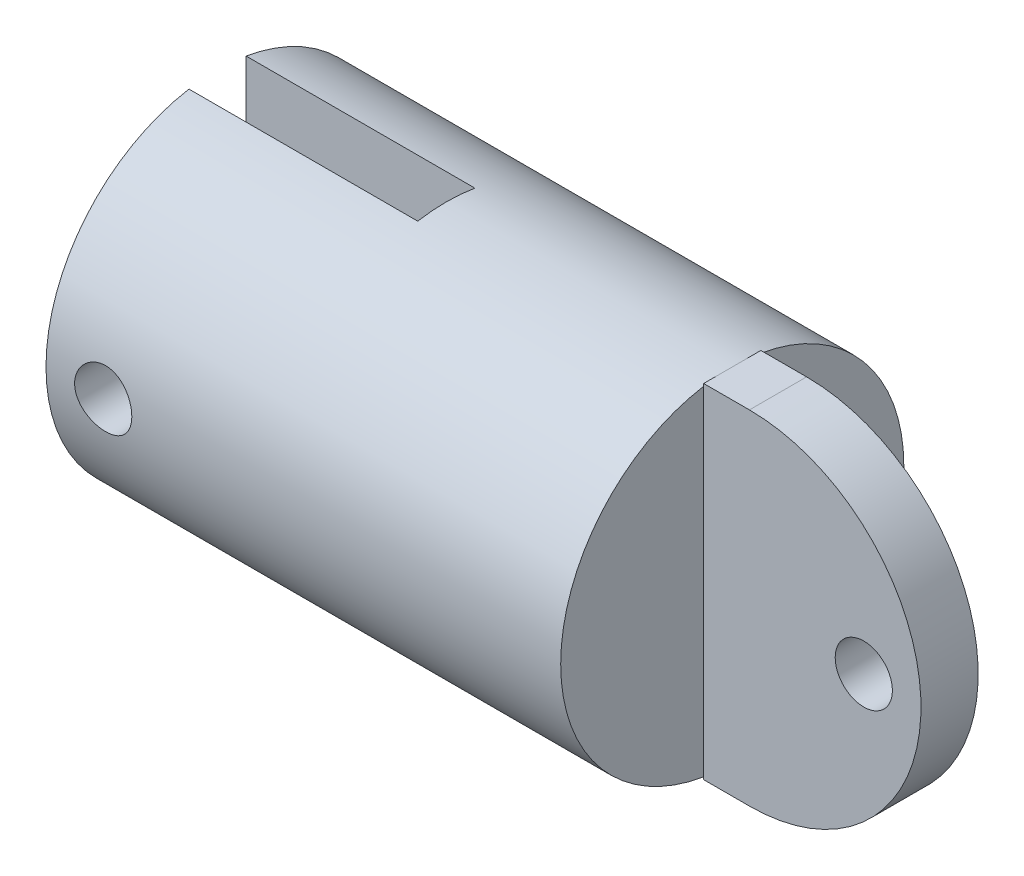
ISO-10303-21;
HEADER;
FILE_DESCRIPTION(('STEP AP214'),'2;1');
FILE_NAME('part.step','',(''),(''),'','','');
FILE_SCHEMA(('AUTOMOTIVE_DESIGN { 1 0 10303 214 1 1 1 1 }'));
ENDSEC;
DATA;
#1=APPLICATION_CONTEXT('core data for automotive mechanical design processes');
#2=APPLICATION_PROTOCOL_DEFINITION('international standard','automotive_design',2000,#1);
#3=PRODUCT_CONTEXT('',#1,'mechanical');
#4=PRODUCT('Part','Part','',(#3));
#5=PRODUCT_RELATED_PRODUCT_CATEGORY('part','',(#4));
#6=PRODUCT_DEFINITION_FORMATION('','',#4);
#7=PRODUCT_DEFINITION_CONTEXT('part definition',#1,'design');
#8=PRODUCT_DEFINITION('design','',#6,#7);
#9=PRODUCT_DEFINITION_SHAPE('','',#8);
#10=(LENGTH_UNIT() NAMED_UNIT(*) SI_UNIT(.MILLI.,.METRE.));
#11=(NAMED_UNIT(*) PLANE_ANGLE_UNIT() SI_UNIT($,.RADIAN.));
#12=(NAMED_UNIT(*) SI_UNIT($,.STERADIAN.) SOLID_ANGLE_UNIT());
#13=UNCERTAINTY_MEASURE_WITH_UNIT(LENGTH_MEASURE(1.E-05),#10,'distance_accuracy_value','');
#14=(GEOMETRIC_REPRESENTATION_CONTEXT(3) GLOBAL_UNCERTAINTY_ASSIGNED_CONTEXT((#13)) GLOBAL_UNIT_ASSIGNED_CONTEXT((#10,
#11,#12)) REPRESENTATION_CONTEXT('',''));
#15=CARTESIAN_POINT('',(0.,0.,0.));
#16=DIRECTION('',(0.,0.,1.));
#17=DIRECTION('',(1.,0.,0.));
#18=AXIS2_PLACEMENT_3D('',#15,#16,#17);
#19=CARTESIAN_POINT('',(0.,0.,0.));
#20=DIRECTION('',(1.,0.,0.));
#21=DIRECTION('',(0.,0.,-1.));
#22=AXIS2_PLACEMENT_3D('',#19,#20,#21);
#23=PLANE('',#22);
#24=DIRECTION('',(0.,1.,0.));
#25=VECTOR('',#24,1.);
#26=CARTESIAN_POINT('',(0.,15.,-2.5));
#27=LINE('',#26,#25);
#28=CARTESIAN_POINT('',(0.,-14.790199457749,-2.5));
#29=VERTEX_POINT('',#28);
#30=CARTESIAN_POINT('',(0.,14.790199457749,-2.5));
#31=VERTEX_POINT('',#30);
#32=EDGE_CURVE('E11',#29,#31,#27,.T.);
#33=ORIENTED_EDGE('',*,*,#32,.F.);
#34=CARTESIAN_POINT('',(0.,0.,0.));
#35=DIRECTION('',(1.,0.,0.));
#36=DIRECTION('',(0.,0.,-1.));
#37=AXIS2_PLACEMENT_3D('',#34,#35,#36);
#38=CIRCLE('',#37,15.);
#39=EDGE_CURVE('E269',#29,#31,#38,.T.);
#40=ORIENTED_EDGE('',*,*,#39,.T.);
#41=EDGE_LOOP('',(#33,#40));
#42=FACE_BOUND('',#41,.T.);
#43=ADVANCED_FACE('F39',(#42),#23,.T.);
#44=CARTESIAN_POINT('',(-45.,0.,0.));
#45=DIRECTION('',(1.,0.,0.));
#46=DIRECTION('',(0.,0.,-1.));
#47=AXIS2_PLACEMENT_3D('',#44,#45,#46);
#48=PLANE('',#47);
#49=CARTESIAN_POINT('',(-45.,0.,0.));
#50=DIRECTION('',(1.,0.,0.));
#51=DIRECTION('',(0.,0.,-1.));
#52=AXIS2_PLACEMENT_3D('',#49,#50,#51);
#53=CIRCLE('',#52,15.);
#54=CARTESIAN_POINT('',(-45.,-14.790199457749,-2.5));
#55=VERTEX_POINT('',#54);
#56=CARTESIAN_POINT('',(-45.,14.790199457749,-2.5));
#57=VERTEX_POINT('',#56);
#58=EDGE_CURVE('E253',#55,#57,#53,.T.);
#59=ORIENTED_EDGE('',*,*,#58,.F.);
#60=DIRECTION('',(0.,1.,0.));
#61=VECTOR('',#60,1.);
#62=CARTESIAN_POINT('',(-45.,0.,-2.5));
#63=LINE('',#62,#61);
#64=EDGE_CURVE('E254',#55,#57,#63,.T.);
#65=ORIENTED_EDGE('',*,*,#64,.T.);
#66=EDGE_LOOP('',(#59,#65));
#67=FACE_BOUND('',#66,.T.);
#68=ADVANCED_FACE('F236',(#67),#48,.F.);
#69=CARTESIAN_POINT('',(-45.,0.,0.));
#70=DIRECTION('',(1.,0.,0.));
#71=DIRECTION('',(0.,0.,-1.));
#72=AXIS2_PLACEMENT_3D('',#69,#70,#71);
#73=CYLINDRICAL_SURFACE('',#72,15.);
#74=CARTESIAN_POINT('',(-37.5,0.,-15.));
#75=CARTESIAN_POINT('',(-37.5000055889478,-0.139390904958214,-14.9999976116882));
#76=CARTESIAN_POINT('',(-37.5116972749689,-0.27885788183882,-14.9980367791303));
#77=CARTESIAN_POINT('',(-37.5581356587653,-0.553880221673041,-14.9904034494139));
#78=CARTESIAN_POINT('',(-37.5929035569116,-0.689431867959245,-14.9847275392389));
#79=CARTESIAN_POINT('',(-37.6844154485928,-0.952604747212642,-14.9703006823645));
#80=CARTESIAN_POINT('',(-37.7411414656406,-1.0802323684319,-14.9615522515919));
#81=CARTESIAN_POINT('',(-37.8749122920524,-1.32414184197794,-14.9419422708207));
#82=CARTESIAN_POINT('',(-37.951954777483,-1.44042498987859,-14.9310809625443));
#83=CARTESIAN_POINT('',(-38.1249550838205,-1.65947261429168,-14.9083331745831));
#84=CARTESIAN_POINT('',(-38.2210691146361,-1.76211290353497,-14.8964387181486));
#85=CARTESIAN_POINT('',(-38.4291479684728,-1.94988849865992,-14.8730262687673));
#86=CARTESIAN_POINT('',(-38.5411137914566,-2.03502269939097,-14.8615082996267));
#87=CARTESIAN_POINT('',(-38.7785709661971,-2.18586712560513,-14.8400756575978));
#88=CARTESIAN_POINT('',(-38.9041413368048,-2.251454552861,-14.8301712909164));
#89=CARTESIAN_POINT('',(-39.1647095643006,-2.36055836541122,-14.8131978979467));
#90=CARTESIAN_POINT('',(-39.2997067836776,-2.40407624156561,-14.8061286801431));
#91=CARTESIAN_POINT('',(-39.5739802748565,-2.4674143777848,-14.7957053684276));
#92=CARTESIAN_POINT('',(-39.7132057365014,-2.4874490291354,-14.792317684857));
#93=CARTESIAN_POINT('',(-39.9930802768835,-2.50391672528987,-14.7895393893665));
#94=CARTESIAN_POINT('',(-40.1337292541673,-2.50035144038899,-14.7901484945721));
#95=CARTESIAN_POINT('',(-40.4109278612754,-2.46989509839615,-14.7952642886356));
#96=CARTESIAN_POINT('',(-40.5475048035452,-2.44324488188977,-14.7997307331892));
#97=CARTESIAN_POINT('',(-40.8142213178291,-2.36775314040344,-14.8119949521101));
#98=CARTESIAN_POINT('',(-40.9443606688885,-2.31891085431974,-14.8197928407327));
#99=CARTESIAN_POINT('',(-41.1952288234409,-2.20017724609391,-14.837884793341));
#100=CARTESIAN_POINT('',(-41.3159094060812,-2.13018591387971,-14.8481906710733));
#101=CARTESIAN_POINT('',(-41.5439044005384,-1.97121201755743,-14.8701291841501));
#102=CARTESIAN_POINT('',(-41.6512177324549,-1.88222792065428,-14.8817619265429));
#103=CARTESIAN_POINT('',(-41.8508260858073,-1.68648221215905,-14.9052202787979));
#104=CARTESIAN_POINT('',(-41.9429185185401,-1.57951396387312,-14.9170464923165));
#105=CARTESIAN_POINT('',(-42.1078777626653,-1.35153524898164,-14.9394260139672));
#106=CARTESIAN_POINT('',(-42.1807444501832,-1.23052469190642,-14.9499793138975));
#107=CARTESIAN_POINT('',(-42.3052022271363,-0.977705916166708,-14.9686389289291));
#108=CARTESIAN_POINT('',(-42.3567754193312,-0.845888725564658,-14.9767431840745));
#109=CARTESIAN_POINT('',(-42.436994215246,-0.57529834560273,-14.9895750301266));
#110=CARTESIAN_POINT('',(-42.4656417369737,-0.436525739179468,-14.9943029035047));
#111=CARTESIAN_POINT('',(-42.4989213584611,-0.157709901301625,-14.9998112984269));
#112=CARTESIAN_POINT('',(-42.5038315718056,-0.0177007371510125,-15.0006375301278));
#113=CARTESIAN_POINT('',(-42.4902386555719,0.261139772889886,-14.9983747442117));
#114=CARTESIAN_POINT('',(-42.4717364268663,0.399971163892037,-14.9952858772412));
#115=CARTESIAN_POINT('',(-42.4120751506645,0.671656175546761,-14.985568269382));
#116=CARTESIAN_POINT('',(-42.3710537916099,0.804540868385377,-14.9789610480131));
#117=CARTESIAN_POINT('',(-42.2676654818005,1.06154688486044,-14.9629446445536));
#118=CARTESIAN_POINT('',(-42.2052973323647,1.18566771590972,-14.9535353051202));
#119=CARTESIAN_POINT('',(-42.0603488753032,1.42283068946895,-14.9328451630241));
#120=CARTESIAN_POINT('',(-41.9775948438327,1.53576525093714,-14.9215485588702));
#121=CARTESIAN_POINT('',(-41.7944626846149,1.74624358550268,-14.898384673919));
#122=CARTESIAN_POINT('',(-41.6940832767233,1.84378623969658,-14.8865173517155));
#123=CARTESIAN_POINT('',(-41.4773024519286,2.021742779658,-14.8634017523585));
#124=CARTESIAN_POINT('',(-41.3607458344856,2.10196876111371,-14.8521611613711));
#125=CARTESIAN_POINT('',(-41.1156470308615,2.24170231029498,-14.8317152977788));
#126=CARTESIAN_POINT('',(-40.9871052247725,2.30121053476982,-14.8225099606602));
#127=CARTESIAN_POINT('',(-40.7222102671879,2.39753833147314,-14.807234536977));
#128=CARTESIAN_POINT('',(-40.5858919049695,2.43445143254794,-14.8011515431106));
#129=CARTESIAN_POINT('',(-40.3088798707782,2.48483545377827,-14.7927771683526));
#130=CARTESIAN_POINT('',(-40.168186580268,2.49830841194616,-14.7904854578272));
#131=CARTESIAN_POINT('',(-39.8882948340376,2.50137286604735,-14.7899673308401));
#132=CARTESIAN_POINT('',(-39.7490996214247,2.49126013612518,-14.7916905650565));
#133=CARTESIAN_POINT('',(-39.4744207519492,2.44807983895684,-14.7988978145373));
#134=CARTESIAN_POINT('',(-39.3389370830581,2.41501234611247,-14.8043818176121));
#135=CARTESIAN_POINT('',(-39.0756415627074,2.3269744895949,-14.8184735628172));
#136=CARTESIAN_POINT('',(-38.947820989944,2.27202959060044,-14.8270776721967));
#137=CARTESIAN_POINT('',(-38.7031643308052,2.1418270039159,-14.8464436892221));
#138=CARTESIAN_POINT('',(-38.5863287896279,2.06656830874856,-14.857205703884));
#139=CARTESIAN_POINT('',(-38.3654644168922,1.89681888437215,-14.8798345404562));
#140=CARTESIAN_POINT('',(-38.2616039832997,1.80211056359364,-14.891712955763));
#141=CARTESIAN_POINT('',(-38.0711483955251,1.59660903138023,-14.9151437236084));
#142=CARTESIAN_POINT('',(-37.9845572313618,1.48581211291263,-14.9266960002655));
#143=CARTESIAN_POINT('',(-37.8305517318001,1.25036916964028,-14.9482652964222));
#144=CARTESIAN_POINT('',(-37.7632739606871,1.12563278753282,-14.958271162531));
#145=CARTESIAN_POINT('',(-37.6507305153901,0.866513069378978,-14.9755116760178));
#146=CARTESIAN_POINT('',(-37.6054429189203,0.732139494830007,-14.9827490817748));
#147=CARTESIAN_POINT('',(-37.5479947258733,0.497703310045398,-14.9920579083296));
#148=CARTESIAN_POINT('',(-37.530025530384,0.399058830298446,-14.9950202727336));
#149=CARTESIAN_POINT('',(-37.5060262621553,0.200289310319808,-14.9989921598612));
#150=CARTESIAN_POINT('',(-37.4999959838626,0.100164295608494,-15.0000017162064));
#151=CARTESIAN_POINT('',(-37.5,0.,-15.));
#152=B_SPLINE_CURVE_WITH_KNOTS('',3,(#74,#75,#76,#77,#78,#79,#80,#81,#82,#83,#84,#85,#86,#87,
#88,#89,#90,#91,#92,#93,#94,#95,#96,#97,#98,#99,#100,#101,#102,#103,#104,#105,#106,#107,#108,
#109,#110,#111,#112,#113,#114,#115,#116,#117,#118,#119,#120,#121,#122,#123,#124,#125,#126,#127,
#128,#129,#130,#131,#132,#133,#134,#135,#136,#137,#138,#139,#140,#141,#142,#143,#144,#145,#146,
#147,#148,#149,#150,#151),.UNSPECIFIED.,.T.,.F.,(4,2,2,2,2,2,2,2,2,2,2,2,2,2,2,2,2,2,2,2,2,2,2,
2,2,2,2,2,2,2,2,2,2,2,2,2,2,2,4),(0.,0.417806584938508,0.835997545695418,1.25384686702527,
1.67164841267479,2.09302491062332,2.51442800169856,2.93842520823839,3.36239376876181,
3.78246077103423,4.20249804320886,4.61820521760408,5.0339266502538,5.45164556632557,
5.86939820680572,6.29232769911326,6.71525991635847,7.13854688915902,7.56179844521147,
7.98007883491396,8.39834313035858,8.81407807006414,9.22983635826064,9.64926825627022,
10.0687306305428,10.4925382200762,10.9163323737594,11.3383602234177,11.7603513778662,
12.177079095227,12.5938054618813,13.0100481822622,13.4263115502933,13.8475138419339,
14.2688133387897,14.693022316072,15.1168075213007,15.4170424816401,15.7172722727696),.UNSPECIFIED.);
#153=CARTESIAN_POINT('',(-37.5,0.,-15.));
#154=VERTEX_POINT('',#153);
#155=EDGE_CURVE('E204',#154,#154,#152,.T.);
#156=ORIENTED_EDGE('',*,*,#155,.F.);
#157=EDGE_LOOP('',(#156));
#158=FACE_BOUND('',#157,.T.);
#159=CARTESIAN_POINT('',(-37.5,0.,15.));
#160=CARTESIAN_POINT('',(-37.5000055889478,0.139390904958214,14.9999976116882));
#161=CARTESIAN_POINT('',(-37.5116972749689,0.27885788183882,14.9980367791303));
#162=CARTESIAN_POINT('',(-37.5581356587653,0.553880221673041,14.9904034494139));
#163=CARTESIAN_POINT('',(-37.5929035569116,0.689431867959245,14.9847275392389));
#164=CARTESIAN_POINT('',(-37.6844154485928,0.952604747212642,14.9703006823645));
#165=CARTESIAN_POINT('',(-37.7411414656406,1.0802323684319,14.9615522515919));
#166=CARTESIAN_POINT('',(-37.8749122920524,1.32414184197794,14.9419422708207));
#167=CARTESIAN_POINT('',(-37.951954777483,1.44042498987859,14.9310809625443));
#168=CARTESIAN_POINT('',(-38.1249550838205,1.65947261429168,14.9083331745831));
#169=CARTESIAN_POINT('',(-38.2210691146361,1.76211290353497,14.8964387181486));
#170=CARTESIAN_POINT('',(-38.4291479684728,1.94988849865992,14.8730262687673));
#171=CARTESIAN_POINT('',(-38.5411137914566,2.03502269939097,14.8615082996267));
#172=CARTESIAN_POINT('',(-38.7785709661971,2.18586712560513,14.8400756575978));
#173=CARTESIAN_POINT('',(-38.9041413368048,2.251454552861,14.8301712909164));
#174=CARTESIAN_POINT('',(-39.1647095643006,2.36055836541122,14.8131978979467));
#175=CARTESIAN_POINT('',(-39.2997067836776,2.40407624156561,14.8061286801431));
#176=CARTESIAN_POINT('',(-39.5739802748565,2.4674143777848,14.7957053684276));
#177=CARTESIAN_POINT('',(-39.7132057365014,2.4874490291354,14.792317684857));
#178=CARTESIAN_POINT('',(-39.9930802768835,2.50391672528987,14.7895393893665));
#179=CARTESIAN_POINT('',(-40.1337292541673,2.50035144038899,14.7901484945721));
#180=CARTESIAN_POINT('',(-40.4109278612754,2.46989509839615,14.7952642886356));
#181=CARTESIAN_POINT('',(-40.5475048035452,2.44324488188977,14.7997307331892));
#182=CARTESIAN_POINT('',(-40.8142213178291,2.36775314040344,14.8119949521101));
#183=CARTESIAN_POINT('',(-40.9443606688885,2.31891085431974,14.8197928407327));
#184=CARTESIAN_POINT('',(-41.1952288234409,2.20017724609391,14.837884793341));
#185=CARTESIAN_POINT('',(-41.3159094060812,2.13018591387971,14.8481906710733));
#186=CARTESIAN_POINT('',(-41.5439044005384,1.97121201755743,14.8701291841501));
#187=CARTESIAN_POINT('',(-41.6512177324549,1.88222792065428,14.8817619265429));
#188=CARTESIAN_POINT('',(-41.8508260858073,1.68648221215905,14.9052202787979));
#189=CARTESIAN_POINT('',(-41.9429185185401,1.57951396387312,14.9170464923165));
#190=CARTESIAN_POINT('',(-42.1078777626653,1.35153524898164,14.9394260139672));
#191=CARTESIAN_POINT('',(-42.1807444501832,1.23052469190642,14.9499793138975));
#192=CARTESIAN_POINT('',(-42.3052022271363,0.977705916166708,14.9686389289291));
#193=CARTESIAN_POINT('',(-42.3567754193312,0.845888725564658,14.9767431840745));
#194=CARTESIAN_POINT('',(-42.436994215246,0.57529834560273,14.9895750301266));
#195=CARTESIAN_POINT('',(-42.4656417369737,0.436525739179468,14.9943029035047));
#196=CARTESIAN_POINT('',(-42.4989213584611,0.157709901301625,14.9998112984269));
#197=CARTESIAN_POINT('',(-42.5038315718056,0.0177007371510125,15.0006375301278));
#198=CARTESIAN_POINT('',(-42.4902386555719,-0.261139772889886,14.9983747442117));
#199=CARTESIAN_POINT('',(-42.4717364268663,-0.399971163892037,14.9952858772412));
#200=CARTESIAN_POINT('',(-42.4120751506645,-0.671656175546761,14.985568269382));
#201=CARTESIAN_POINT('',(-42.3710537916099,-0.804540868385377,14.9789610480131));
#202=CARTESIAN_POINT('',(-42.2676654818005,-1.06154688486044,14.9629446445536));
#203=CARTESIAN_POINT('',(-42.2052973323647,-1.18566771590972,14.9535353051202));
#204=CARTESIAN_POINT('',(-42.0603488753032,-1.42283068946895,14.9328451630241));
#205=CARTESIAN_POINT('',(-41.9775948438327,-1.53576525093714,14.9215485588702));
#206=CARTESIAN_POINT('',(-41.7944626846149,-1.74624358550268,14.898384673919));
#207=CARTESIAN_POINT('',(-41.6940832767233,-1.84378623969658,14.8865173517155));
#208=CARTESIAN_POINT('',(-41.4773024519286,-2.021742779658,14.8634017523585));
#209=CARTESIAN_POINT('',(-41.3607458344856,-2.10196876111371,14.8521611613711));
#210=CARTESIAN_POINT('',(-41.1156470308615,-2.24170231029498,14.8317152977788));
#211=CARTESIAN_POINT('',(-40.9871052247725,-2.30121053476982,14.8225099606602));
#212=CARTESIAN_POINT('',(-40.7222102671879,-2.39753833147314,14.807234536977));
#213=CARTESIAN_POINT('',(-40.5858919049695,-2.43445143254794,14.8011515431106));
#214=CARTESIAN_POINT('',(-40.3088798707782,-2.48483545377827,14.7927771683526));
#215=CARTESIAN_POINT('',(-40.168186580268,-2.49830841194616,14.7904854578272));
#216=CARTESIAN_POINT('',(-39.8882948340376,-2.50137286604735,14.7899673308401));
#217=CARTESIAN_POINT('',(-39.7490996214247,-2.49126013612518,14.7916905650565));
#218=CARTESIAN_POINT('',(-39.4744207519492,-2.44807983895684,14.7988978145373));
#219=CARTESIAN_POINT('',(-39.3389370830581,-2.41501234611247,14.8043818176121));
#220=CARTESIAN_POINT('',(-39.0756415627074,-2.3269744895949,14.8184735628172));
#221=CARTESIAN_POINT('',(-38.947820989944,-2.27202959060044,14.8270776721967));
#222=CARTESIAN_POINT('',(-38.7031643308052,-2.1418270039159,14.8464436892221));
#223=CARTESIAN_POINT('',(-38.5863287896279,-2.06656830874856,14.857205703884));
#224=CARTESIAN_POINT('',(-38.3654644168922,-1.89681888437215,14.8798345404562));
#225=CARTESIAN_POINT('',(-38.2616039832997,-1.80211056359364,14.891712955763));
#226=CARTESIAN_POINT('',(-38.0711483955251,-1.59660903138023,14.9151437236084));
#227=CARTESIAN_POINT('',(-37.9845572313618,-1.48581211291263,14.9266960002655));
#228=CARTESIAN_POINT('',(-37.8305517318001,-1.25036916964028,14.9482652964222));
#229=CARTESIAN_POINT('',(-37.7632739606871,-1.12563278753282,14.958271162531));
#230=CARTESIAN_POINT('',(-37.6507305153901,-0.866513069378978,14.9755116760178));
#231=CARTESIAN_POINT('',(-37.6054429189203,-0.732139494830007,14.9827490817748));
#232=CARTESIAN_POINT('',(-37.5479947258733,-0.497703310045398,14.9920579083296));
#233=CARTESIAN_POINT('',(-37.530025530384,-0.399058830298446,14.9950202727336));
#234=CARTESIAN_POINT('',(-37.5060262621553,-0.200289310319808,14.9989921598612));
#235=CARTESIAN_POINT('',(-37.4999959838626,-0.100164295608494,15.0000017162064));
#236=CARTESIAN_POINT('',(-37.5,0.,15.));
#237=B_SPLINE_CURVE_WITH_KNOTS('',3,(#159,#160,#161,#162,#163,#164,#165,#166,#167,#168,#169,
#170,#171,#172,#173,#174,#175,#176,#177,#178,#179,#180,#181,#182,#183,#184,#185,#186,#187,#188,
#189,#190,#191,#192,#193,#194,#195,#196,#197,#198,#199,#200,#201,#202,#203,#204,#205,#206,#207,
#208,#209,#210,#211,#212,#213,#214,#215,#216,#217,#218,#219,#220,#221,#222,#223,#224,#225,#226,
#227,#228,#229,#230,#231,#232,#233,#234,#235,#236),.UNSPECIFIED.,.T.,.F.,(4,2,2,2,2,2,2,2,2,2,2,
2,2,2,2,2,2,2,2,2,2,2,2,2,2,2,2,2,2,2,2,2,2,2,2,2,2,2,4),(0.,0.417806584938508,
0.835997545695418,1.25384686702527,1.67164841267479,2.09302491062332,2.51442800169856,
2.93842520823839,3.36239376876181,3.78246077103423,4.20249804320886,4.61820521760408,
5.0339266502538,5.45164556632557,5.86939820680572,6.29232769911326,6.71525991635847,
7.13854688915902,7.56179844521147,7.98007883491396,8.39834313035858,8.81407807006414,
9.22983635826064,9.64926825627022,10.0687306305428,10.4925382200762,10.9163323737594,
11.3383602234177,11.7603513778662,12.177079095227,12.5938054618813,13.0100481822622,
13.4263115502933,13.8475138419339,14.2688133387897,14.693022316072,15.1168075213007,
15.4170424816401,15.7172722727696),.UNSPECIFIED.);
#238=CARTESIAN_POINT('',(-37.5,0.,15.));
#239=VERTEX_POINT('',#238);
#240=EDGE_CURVE('E196',#239,#239,#237,.T.);
#241=ORIENTED_EDGE('',*,*,#240,.F.);
#242=EDGE_LOOP('',(#241));
#243=FACE_BOUND('',#242,.T.);
#244=DIRECTION('',(1.,0.,0.));
#245=VECTOR('',#244,1.);
#246=CARTESIAN_POINT('',(-45.,-14.790199457749,-2.5));
#247=LINE('',#246,#245);
#248=CARTESIAN_POINT('',(-25.,-14.790199457749,-2.5));
#249=VERTEX_POINT('',#248);
#250=EDGE_CURVE('E294',#55,#249,#247,.T.);
#251=ORIENTED_EDGE('',*,*,#250,.F.);
#252=ORIENTED_EDGE('',*,*,#58,.T.);
#253=DIRECTION('',(1.,0.,0.));
#254=VECTOR('',#253,1.);
#255=CARTESIAN_POINT('',(-45.,14.790199457749,-2.5));
#256=LINE('',#255,#254);
#257=CARTESIAN_POINT('',(-25.,14.790199457749,-2.5));
#258=VERTEX_POINT('',#257);
#259=EDGE_CURVE('E271',#258,#57,#256,.F.);
#260=ORIENTED_EDGE('',*,*,#259,.F.);
#261=CARTESIAN_POINT('',(-25.,0.,0.));
#262=DIRECTION('',(1.,0.,0.));
#263=DIRECTION('',(0.,0.,-1.));
#264=AXIS2_PLACEMENT_3D('',#261,#262,#263);
#265=CIRCLE('',#264,15.);
#266=CARTESIAN_POINT('',(-25.,14.790199457749,2.5));
#267=VERTEX_POINT('',#266);
#268=EDGE_CURVE('E279',#267,#258,#265,.F.);
#269=ORIENTED_EDGE('',*,*,#268,.F.);
#270=DIRECTION('',(1.,0.,0.));
#271=VECTOR('',#270,1.);
#272=CARTESIAN_POINT('',(-45.,14.790199457749,2.5));
#273=LINE('',#272,#271);
#274=CARTESIAN_POINT('',(-45.,14.790199457749,2.5));
#275=VERTEX_POINT('',#274);
#276=EDGE_CURVE('E321',#275,#267,#273,.T.);
#277=ORIENTED_EDGE('',*,*,#276,.F.);
#278=CARTESIAN_POINT('',(-45.,-14.790199457749,2.5));
#279=VERTEX_POINT('',#278);
#280=EDGE_CURVE('E259',#275,#279,#53,.T.);
#281=ORIENTED_EDGE('',*,*,#280,.T.);
#282=DIRECTION('',(1.,0.,0.));
#283=VECTOR('',#282,1.);
#284=CARTESIAN_POINT('',(-45.,-14.790199457749,2.5));
#285=LINE('',#284,#283);
#286=CARTESIAN_POINT('',(-25.,-14.790199457749,2.5));
#287=VERTEX_POINT('',#286);
#288=EDGE_CURVE('E318',#287,#279,#285,.F.);
#289=ORIENTED_EDGE('',*,*,#288,.F.);
#290=EDGE_CURVE('E281',#249,#287,#265,.F.);
#291=ORIENTED_EDGE('',*,*,#290,.F.);
#292=EDGE_LOOP('',(#251,#252,#260,#269,#277,#281,#289,#291));
#293=FACE_BOUND('',#292,.T.);
#294=CARTESIAN_POINT('',(0.,15.,0.));
#295=VERTEX_POINT('',#294);
#296=EDGE_CURVE('E260',#31,#295,#38,.T.);
#297=ORIENTED_EDGE('',*,*,#296,.F.);
#298=ORIENTED_EDGE('',*,*,#39,.F.);
#299=CARTESIAN_POINT('',(0.,-15.,0.));
#300=VERTEX_POINT('',#299);
#301=EDGE_CURVE('E64',#300,#29,#38,.T.);
#302=ORIENTED_EDGE('',*,*,#301,.F.);
#303=CARTESIAN_POINT('',(0.,-14.790199457749,2.5));
#304=VERTEX_POINT('',#303);
#305=EDGE_CURVE('E310',#304,#300,#38,.T.);
#306=ORIENTED_EDGE('',*,*,#305,.F.);
#307=CARTESIAN_POINT('',(0.,14.790199457749,2.5));
#308=VERTEX_POINT('',#307);
#309=EDGE_CURVE('E313',#308,#304,#38,.T.);
#310=ORIENTED_EDGE('',*,*,#309,.F.);
#311=EDGE_CURVE('E267',#295,#308,#38,.T.);
#312=ORIENTED_EDGE('',*,*,#311,.F.);
#313=EDGE_LOOP('',(#297,#298,#302,#306,#310,#312));
#314=FACE_BOUND('',#313,.T.);
#315=ADVANCED_FACE('F41',(#158,#243,#293,#314),#73,.T.);
#316=ORIENTED_EDGE('',*,*,#280,.F.);
#317=DIRECTION('',(0.,-1.,0.));
#318=VECTOR('',#317,1.);
#319=CARTESIAN_POINT('',(-45.,0.,2.5));
#320=LINE('',#319,#318);
#321=EDGE_CURVE('E265',#275,#279,#320,.T.);
#322=ORIENTED_EDGE('',*,*,#321,.T.);
#323=EDGE_LOOP('',(#316,#322));
#324=FACE_BOUND('',#323,.T.);
#325=ADVANCED_FACE('F233',(#324),#48,.F.);
#326=DIRECTION('',(0.,-1.,0.));
#327=VECTOR('',#326,1.);
#328=CARTESIAN_POINT('',(0.,15.,2.5));
#329=LINE('',#328,#327);
#330=EDGE_CURVE('E50',#308,#304,#329,.T.);
#331=ORIENTED_EDGE('',*,*,#330,.F.);
#332=ORIENTED_EDGE('',*,*,#309,.T.);
#333=EDGE_LOOP('',(#331,#332));
#334=FACE_BOUND('',#333,.T.);
#335=ADVANCED_FACE('F224',(#334),#23,.T.);
#336=CARTESIAN_POINT('',(-45.,-15.,-2.5));
#337=DIRECTION('',(0.,0.,-1.));
#338=DIRECTION('',(-1.,0.,0.));
#339=AXIS2_PLACEMENT_3D('',#336,#337,#338);
#340=PLANE('',#339);
#341=CARTESIAN_POINT('',(-40.,0.,-2.5));
#342=DIRECTION('',(0.,0.,-1.));
#343=DIRECTION('',(-1.,0.,0.));
#344=AXIS2_PLACEMENT_3D('',#341,#342,#343);
#345=CIRCLE('',#344,2.49999999999999);
#346=CARTESIAN_POINT('',(-42.5,0.,-2.5));
#347=VERTEX_POINT('',#346);
#348=EDGE_CURVE('E192',#347,#347,#345,.T.);
#349=ORIENTED_EDGE('',*,*,#348,.T.);
#350=EDGE_LOOP('',(#349));
#351=FACE_BOUND('',#350,.T.);
#352=ORIENTED_EDGE('',*,*,#259,.T.);
#353=ORIENTED_EDGE('',*,*,#64,.F.);
#354=ORIENTED_EDGE('',*,*,#250,.T.);
#355=DIRECTION('',(0.,1.,0.));
#356=VECTOR('',#355,1.);
#357=CARTESIAN_POINT('',(-25.,-15.,-2.5));
#358=LINE('',#357,#356);
#359=EDGE_CURVE('E327',#249,#258,#358,.T.);
#360=ORIENTED_EDGE('',*,*,#359,.T.);
#361=EDGE_LOOP('',(#352,#353,#354,#360));
#362=FACE_BOUND('',#361,.T.);
#363=ADVANCED_FACE('F219',(#351,#362),#340,.F.);
#364=CARTESIAN_POINT('',(-25.,-15.,-2.5));
#365=DIRECTION('',(1.,0.,0.));
#366=DIRECTION('',(0.,0.,-1.));
#367=AXIS2_PLACEMENT_3D('',#364,#365,#366);
#368=PLANE('',#367);
#369=ORIENTED_EDGE('',*,*,#359,.F.);
#370=ORIENTED_EDGE('',*,*,#290,.T.);
#371=DIRECTION('',(0.,1.,0.));
#372=VECTOR('',#371,1.);
#373=CARTESIAN_POINT('',(-25.,-15.,2.5));
#374=LINE('',#373,#372);
#375=EDGE_CURVE('E328',#287,#267,#374,.T.);
#376=ORIENTED_EDGE('',*,*,#375,.T.);
#377=ORIENTED_EDGE('',*,*,#268,.T.);
#378=EDGE_LOOP('',(#369,#370,#376,#377));
#379=FACE_BOUND('',#378,.T.);
#380=ADVANCED_FACE('F223',(#379),#368,.F.);
#381=CARTESIAN_POINT('',(-45.,-15.,2.5));
#382=DIRECTION('',(0.,0.,1.));
#383=DIRECTION('',(1.,0.,0.));
#384=AXIS2_PLACEMENT_3D('',#381,#382,#383);
#385=PLANE('',#384);
#386=CARTESIAN_POINT('',(-40.,0.,2.5));
#387=DIRECTION('',(0.,0.,1.));
#388=DIRECTION('',(1.,0.,0.));
#389=AXIS2_PLACEMENT_3D('',#386,#387,#388);
#390=CIRCLE('',#389,2.49999999999999);
#391=CARTESIAN_POINT('',(-37.5,0.,2.5));
#392=VERTEX_POINT('',#391);
#393=EDGE_CURVE('E191',#392,#392,#390,.T.);
#394=ORIENTED_EDGE('',*,*,#393,.T.);
#395=EDGE_LOOP('',(#394));
#396=FACE_BOUND('',#395,.T.);
#397=ORIENTED_EDGE('',*,*,#288,.T.);
#398=ORIENTED_EDGE('',*,*,#321,.F.);
#399=ORIENTED_EDGE('',*,*,#276,.T.);
#400=ORIENTED_EDGE('',*,*,#375,.F.);
#401=EDGE_LOOP('',(#397,#398,#399,#400));
#402=FACE_BOUND('',#401,.T.);
#403=ADVANCED_FACE('F228',(#396,#402),#385,.F.);
#404=CARTESIAN_POINT('',(-40.,0.,-15.));
#405=DIRECTION('',(0.,0.,1.));
#406=DIRECTION('',(1.,0.,0.));
#407=AXIS2_PLACEMENT_3D('',#404,#405,#406);
#408=CYLINDRICAL_SURFACE('',#407,2.49999999999999);
#409=ORIENTED_EDGE('',*,*,#240,.T.);
#410=EDGE_LOOP('',(#409));
#411=FACE_BOUND('',#410,.T.);
#412=ORIENTED_EDGE('',*,*,#393,.F.);
#413=EDGE_LOOP('',(#412));
#414=FACE_BOUND('',#413,.T.);
#415=ADVANCED_FACE('F215',(#411,#414),#408,.F.);
#416=ORIENTED_EDGE('',*,*,#155,.T.);
#417=EDGE_LOOP('',(#416));
#418=FACE_BOUND('',#417,.T.);
#419=ORIENTED_EDGE('',*,*,#348,.F.);
#420=EDGE_LOOP('',(#419));
#421=FACE_BOUND('',#420,.T.);
#422=ADVANCED_FACE('F209',(#418,#421),#408,.F.);
#423=CARTESIAN_POINT('',(0.,0.,0.));
#424=DIRECTION('',(-1.,0.,0.));
#425=DIRECTION('',(0.,0.,1.));
#426=AXIS2_PLACEMENT_3D('',#423,#424,#425);
#427=PLANE('',#426);
#428=CARTESIAN_POINT('',(0.,15.,-2.5));
#429=VERTEX_POINT('',#428);
#430=EDGE_CURVE('E53',#31,#429,#27,.T.);
#431=ORIENTED_EDGE('',*,*,#430,.F.);
#432=ORIENTED_EDGE('',*,*,#296,.T.);
#433=DIRECTION('',(0.,0.,1.));
#434=VECTOR('',#433,1.);
#435=CARTESIAN_POINT('',(0.,15.,2.5));
#436=LINE('',#435,#434);
#437=EDGE_CURVE('E171',#429,#295,#436,.T.);
#438=ORIENTED_EDGE('',*,*,#437,.F.);
#439=EDGE_LOOP('',(#431,#432,#438));
#440=FACE_BOUND('',#439,.T.);
#441=ADVANCED_FACE('F214',(#440),#427,.T.);
#442=CARTESIAN_POINT('',(0.,15.,2.5));
#443=VERTEX_POINT('',#442);
#444=EDGE_CURVE('E164',#295,#443,#436,.T.);
#445=ORIENTED_EDGE('',*,*,#444,.F.);
#446=ORIENTED_EDGE('',*,*,#311,.T.);
#447=EDGE_CURVE('E175',#443,#308,#329,.T.);
#448=ORIENTED_EDGE('',*,*,#447,.F.);
#449=EDGE_LOOP('',(#445,#446,#448));
#450=FACE_BOUND('',#449,.T.);
#451=ADVANCED_FACE('F344',(#450),#427,.T.);
#452=CARTESIAN_POINT('',(0.,-15.,2.5));
#453=VERTEX_POINT('',#452);
#454=EDGE_CURVE('E151',#304,#453,#329,.T.);
#455=ORIENTED_EDGE('',*,*,#454,.F.);
#456=ORIENTED_EDGE('',*,*,#305,.T.);
#457=DIRECTION('',(0.,0.,-1.));
#458=VECTOR('',#457,1.);
#459=CARTESIAN_POINT('',(0.,-15.,2.5));
#460=LINE('',#459,#458);
#461=EDGE_CURVE('E179',#453,#300,#460,.T.);
#462=ORIENTED_EDGE('',*,*,#461,.F.);
#463=EDGE_LOOP('',(#455,#456,#462));
#464=FACE_BOUND('',#463,.T.);
#465=ADVANCED_FACE('F348',(#464),#427,.T.);
#466=CARTESIAN_POINT('',(4.,15.,2.5));
#467=DIRECTION('',(0.,-1.,0.));
#468=DIRECTION('',(0.,0.,-1.));
#469=AXIS2_PLACEMENT_3D('',#466,#467,#468);
#470=PLANE('',#469);
#471=ORIENTED_EDGE('',*,*,#437,.T.);
#472=ORIENTED_EDGE('',*,*,#444,.T.);
#473=DIRECTION('',(-1.,0.,0.));
#474=VECTOR('',#473,1.);
#475=CARTESIAN_POINT('',(4.,15.,2.5));
#476=LINE('',#475,#474);
#477=CARTESIAN_POINT('',(4.,15.,2.5));
#478=VERTEX_POINT('',#477);
#479=EDGE_CURVE('E153',#478,#443,#476,.T.);
#480=ORIENTED_EDGE('',*,*,#479,.F.);
#481=DIRECTION('',(0.,0.,1.));
#482=VECTOR('',#481,1.);
#483=CARTESIAN_POINT('',(4.,15.,2.5));
#484=LINE('',#483,#482);
#485=CARTESIAN_POINT('',(4.,15.,-2.5));
#486=VERTEX_POINT('',#485);
#487=EDGE_CURVE('E141',#486,#478,#484,.T.);
#488=ORIENTED_EDGE('',*,*,#487,.F.);
#489=DIRECTION('',(-1.,0.,0.));
#490=VECTOR('',#489,1.);
#491=CARTESIAN_POINT('',(4.,15.,-2.5));
#492=LINE('',#491,#490);
#493=EDGE_CURVE('E140',#486,#429,#492,.T.);
#494=ORIENTED_EDGE('',*,*,#493,.T.);
#495=EDGE_LOOP('',(#471,#472,#480,#488,#494));
#496=FACE_BOUND('',#495,.T.);
#497=ADVANCED_FACE('F217',(#496),#470,.F.);
#498=CARTESIAN_POINT('',(4.,15.,2.5));
#499=DIRECTION('',(0.,0.,-1.));
#500=DIRECTION('',(0.,1.,0.));
#501=AXIS2_PLACEMENT_3D('',#498,#499,#500);
#502=PLANE('',#501);
#503=CARTESIAN_POINT('',(14.,0.,2.5));
#504=DIRECTION('',(0.,0.,-1.));
#505=DIRECTION('',(0.,1.,0.));
#506=AXIS2_PLACEMENT_3D('',#503,#504,#505);
#507=CIRCLE('',#506,2.5);
#508=CARTESIAN_POINT('',(14.,2.5,2.5));
#509=VERTEX_POINT('',#508);
#510=EDGE_CURVE('E160',#509,#509,#507,.T.);
#511=ORIENTED_EDGE('',*,*,#510,.T.);
#512=EDGE_LOOP('',(#511));
#513=FACE_BOUND('',#512,.T.);
#514=ORIENTED_EDGE('',*,*,#447,.T.);
#515=ORIENTED_EDGE('',*,*,#330,.T.);
#516=ORIENTED_EDGE('',*,*,#454,.T.);
#517=DIRECTION('',(-1.,0.,0.));
#518=VECTOR('',#517,1.);
#519=CARTESIAN_POINT('',(4.,-15.,2.5));
#520=LINE('',#519,#518);
#521=CARTESIAN_POINT('',(4.,-15.,2.5));
#522=VERTEX_POINT('',#521);
#523=EDGE_CURVE('E131',#522,#453,#520,.T.);
#524=ORIENTED_EDGE('',*,*,#523,.F.);
#525=CARTESIAN_POINT('',(4.,0.,2.5));
#526=DIRECTION('',(0.,0.,1.));
#527=DIRECTION('',(1.,0.,0.));
#528=AXIS2_PLACEMENT_3D('',#525,#526,#527);
#529=CIRCLE('',#528,15.);
#530=EDGE_CURVE('E148',#522,#478,#529,.T.);
#531=ORIENTED_EDGE('',*,*,#530,.T.);
#532=ORIENTED_EDGE('',*,*,#479,.T.);
#533=EDGE_LOOP('',(#514,#515,#516,#524,#531,#532));
#534=FACE_BOUND('',#533,.T.);
#535=ADVANCED_FACE('F146',(#513,#534),#502,.F.);
#536=CARTESIAN_POINT('',(4.,-15.,2.5));
#537=DIRECTION('',(0.,1.,0.));
#538=DIRECTION('',(0.,0.,1.));
#539=AXIS2_PLACEMENT_3D('',#536,#537,#538);
#540=PLANE('',#539);
#541=ORIENTED_EDGE('',*,*,#461,.T.);
#542=CARTESIAN_POINT('',(0.,-15.,-2.5));
#543=VERTEX_POINT('',#542);
#544=EDGE_CURVE('E178',#300,#543,#460,.T.);
#545=ORIENTED_EDGE('',*,*,#544,.T.);
#546=DIRECTION('',(-1.,0.,0.));
#547=VECTOR('',#546,1.);
#548=CARTESIAN_POINT('',(4.,-15.,-2.5));
#549=LINE('',#548,#547);
#550=CARTESIAN_POINT('',(4.,-15.,-2.5));
#551=VERTEX_POINT('',#550);
#552=EDGE_CURVE('E134',#551,#543,#549,.T.);
#553=ORIENTED_EDGE('',*,*,#552,.F.);
#554=DIRECTION('',(0.,0.,-1.));
#555=VECTOR('',#554,1.);
#556=CARTESIAN_POINT('',(4.,-15.,2.5));
#557=LINE('',#556,#555);
#558=EDGE_CURVE('E127',#522,#551,#557,.T.);
#559=ORIENTED_EDGE('',*,*,#558,.F.);
#560=ORIENTED_EDGE('',*,*,#523,.T.);
#561=EDGE_LOOP('',(#541,#545,#553,#559,#560));
#562=FACE_BOUND('',#561,.T.);
#563=ADVANCED_FACE('F130',(#562),#540,.F.);
#564=CARTESIAN_POINT('',(4.,15.,-2.5));
#565=DIRECTION('',(0.,0.,1.));
#566=DIRECTION('',(0.,-1.,0.));
#567=AXIS2_PLACEMENT_3D('',#564,#565,#566);
#568=PLANE('',#567);
#569=CARTESIAN_POINT('',(14.,0.,-2.5));
#570=DIRECTION('',(0.,0.,1.));
#571=DIRECTION('',(0.,-1.,0.));
#572=AXIS2_PLACEMENT_3D('',#569,#570,#571);
#573=CIRCLE('',#572,2.5);
#574=CARTESIAN_POINT('',(14.,-2.5,-2.5));
#575=VERTEX_POINT('',#574);
#576=EDGE_CURVE('E44',#575,#575,#573,.T.);
#577=ORIENTED_EDGE('',*,*,#576,.T.);
#578=EDGE_LOOP('',(#577));
#579=FACE_BOUND('',#578,.T.);
#580=EDGE_CURVE('E52',#543,#29,#27,.T.);
#581=ORIENTED_EDGE('',*,*,#580,.T.);
#582=ORIENTED_EDGE('',*,*,#32,.T.);
#583=ORIENTED_EDGE('',*,*,#430,.T.);
#584=ORIENTED_EDGE('',*,*,#493,.F.);
#585=CARTESIAN_POINT('',(4.,0.,-2.5));
#586=DIRECTION('',(0.,0.,1.));
#587=DIRECTION('',(1.,0.,0.));
#588=AXIS2_PLACEMENT_3D('',#585,#586,#587);
#589=CIRCLE('',#588,15.);
#590=EDGE_CURVE('E159',#551,#486,#589,.T.);
#591=ORIENTED_EDGE('',*,*,#590,.F.);
#592=ORIENTED_EDGE('',*,*,#552,.T.);
#593=EDGE_LOOP('',(#581,#582,#583,#584,#591,#592));
#594=FACE_BOUND('',#593,.T.);
#595=ADVANCED_FACE('F304',(#579,#594),#568,.F.);
#596=ORIENTED_EDGE('',*,*,#544,.F.);
#597=ORIENTED_EDGE('',*,*,#301,.T.);
#598=ORIENTED_EDGE('',*,*,#580,.F.);
#599=EDGE_LOOP('',(#596,#597,#598));
#600=FACE_BOUND('',#599,.T.);
#601=ADVANCED_FACE('F308',(#600),#427,.T.);
#602=CARTESIAN_POINT('',(4.,0.,-2.5));
#603=DIRECTION('',(0.,0.,1.));
#604=DIRECTION('',(1.,0.,0.));
#605=AXIS2_PLACEMENT_3D('',#602,#603,#604);
#606=CYLINDRICAL_SURFACE('',#605,15.);
#607=ORIENTED_EDGE('',*,*,#530,.F.);
#608=ORIENTED_EDGE('',*,*,#558,.T.);
#609=ORIENTED_EDGE('',*,*,#590,.T.);
#610=ORIENTED_EDGE('',*,*,#487,.T.);
#611=EDGE_LOOP('',(#607,#608,#609,#610));
#612=FACE_BOUND('',#611,.T.);
#613=ADVANCED_FACE('F156',(#612),#606,.T.);
#614=CARTESIAN_POINT('',(14.,0.,-15.));
#615=DIRECTION('',(0.,0.,1.));
#616=DIRECTION('',(1.,0.,0.));
#617=AXIS2_PLACEMENT_3D('',#614,#615,#616);
#618=CYLINDRICAL_SURFACE('',#617,2.5);
#619=ORIENTED_EDGE('',*,*,#576,.F.);
#620=EDGE_LOOP('',(#619));
#621=FACE_BOUND('',#620,.T.);
#622=ORIENTED_EDGE('',*,*,#510,.F.);
#623=EDGE_LOOP('',(#622));
#624=FACE_BOUND('',#623,.T.);
#625=ADVANCED_FACE('F362',(#621,#624),#618,.F.);
#626=CLOSED_SHELL('',(#43,#68,#315,#325,#335,#363,#380,#403,#415,#422,#441,#451,#465,#497,#535,
#563,#595,#601,#613,#625));
#627=MANIFOLD_SOLID_BREP('B2',#626);
#628=ADVANCED_BREP_SHAPE_REPRESENTATION('',(#18,#627),#14);
#629=SHAPE_DEFINITION_REPRESENTATION(#9,#628);
ENDSEC;
END-ISO-10303-21;
